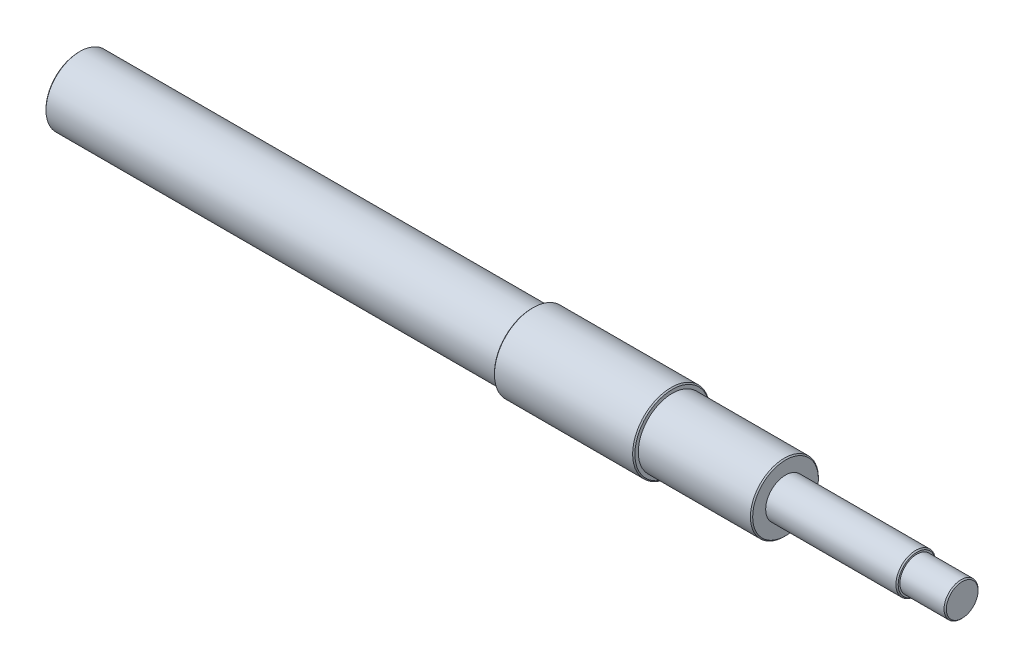
ISO-10303-21;
HEADER;
FILE_DESCRIPTION(('STEP AP214'),'2;1');
FILE_NAME('part.step','',(''),(''),'','','');
FILE_SCHEMA(('AUTOMOTIVE_DESIGN { 1 0 10303 214 1 1 1 1 }'));
ENDSEC;
DATA;
#1=APPLICATION_CONTEXT('core data for automotive mechanical design processes');
#2=APPLICATION_PROTOCOL_DEFINITION('international standard','automotive_design',2000,#1);
#3=PRODUCT_CONTEXT('',#1,'mechanical');
#4=PRODUCT('Part','Part','',(#3));
#5=PRODUCT_RELATED_PRODUCT_CATEGORY('part','',(#4));
#6=PRODUCT_DEFINITION_FORMATION('','',#4);
#7=PRODUCT_DEFINITION_CONTEXT('part definition',#1,'design');
#8=PRODUCT_DEFINITION('design','',#6,#7);
#9=PRODUCT_DEFINITION_SHAPE('','',#8);
#10=(LENGTH_UNIT() NAMED_UNIT(*) SI_UNIT(.MILLI.,.METRE.));
#11=(NAMED_UNIT(*) PLANE_ANGLE_UNIT() SI_UNIT($,.RADIAN.));
#12=(NAMED_UNIT(*) SI_UNIT($,.STERADIAN.) SOLID_ANGLE_UNIT());
#13=UNCERTAINTY_MEASURE_WITH_UNIT(LENGTH_MEASURE(1.E-05),#10,'distance_accuracy_value','');
#14=(GEOMETRIC_REPRESENTATION_CONTEXT(3) GLOBAL_UNCERTAINTY_ASSIGNED_CONTEXT((#13)) GLOBAL_UNIT_ASSIGNED_CONTEXT((#10,
#11,#12)) REPRESENTATION_CONTEXT('',''));
#15=CARTESIAN_POINT('',(0.,0.,0.));
#16=DIRECTION('',(0.,0.,1.));
#17=DIRECTION('',(1.,0.,0.));
#18=AXIS2_PLACEMENT_3D('',#15,#16,#17);
#19=CARTESIAN_POINT('',(-78.,0.,0.));
#20=DIRECTION('',(1.,0.,0.));
#21=DIRECTION('',(0.,0.,-1.));
#22=AXIS2_PLACEMENT_3D('',#19,#20,#21);
#23=PLANE('',#22);
#24=CARTESIAN_POINT('',(-78.,0.,0.));
#25=DIRECTION('',(1.,0.,0.));
#26=DIRECTION('',(0.,0.,-1.));
#27=AXIS2_PLACEMENT_3D('',#24,#25,#26);
#28=CIRCLE('',#27,2.89999999999999);
#29=CARTESIAN_POINT('',(-78.,0.,-2.89999999999999));
#30=VERTEX_POINT('',#29);
#31=EDGE_CURVE('E48',#30,#30,#28,.F.);
#32=ORIENTED_EDGE('',*,*,#31,.T.);
#33=EDGE_LOOP('',(#32));
#34=FACE_BOUND('',#33,.T.);
#35=ADVANCED_FACE('F39',(#34),#23,.F.);
#36=CARTESIAN_POINT('',(0.,0.,0.));
#37=DIRECTION('',(-1.,0.,0.));
#38=DIRECTION('',(0.,0.,1.));
#39=AXIS2_PLACEMENT_3D('',#36,#37,#38);
#40=CYLINDRICAL_SURFACE('',#39,2.99999999999999);
#41=CARTESIAN_POINT('',(-77.9,0.,0.));
#42=DIRECTION('',(1.,0.,0.));
#43=DIRECTION('',(0.,0.,-1.));
#44=AXIS2_PLACEMENT_3D('',#41,#42,#43);
#45=CIRCLE('',#44,2.99999999999999);
#46=CARTESIAN_POINT('',(-77.9,0.,-2.99999999999999));
#47=VERTEX_POINT('',#46);
#48=EDGE_CURVE('E10',#47,#47,#45,.T.);
#49=ORIENTED_EDGE('',*,*,#48,.T.);
#50=EDGE_LOOP('',(#49));
#51=FACE_BOUND('',#50,.T.);
#52=CARTESIAN_POINT('',(-38.,0.,0.));
#53=DIRECTION('',(-1.,0.,0.));
#54=DIRECTION('',(0.,0.,1.));
#55=AXIS2_PLACEMENT_3D('',#52,#53,#54);
#56=CIRCLE('',#55,2.99999999999999);
#57=CARTESIAN_POINT('',(-38.,0.,2.99999999999999));
#58=VERTEX_POINT('',#57);
#59=EDGE_CURVE('E96',#58,#58,#56,.T.);
#60=ORIENTED_EDGE('',*,*,#59,.T.);
#61=EDGE_LOOP('',(#60));
#62=FACE_BOUND('',#61,.T.);
#63=ADVANCED_FACE('F131',(#51,#62),#40,.T.);
#64=CARTESIAN_POINT('',(-38.,2.99999999999999,0.));
#65=DIRECTION('',(1.,0.,0.));
#66=DIRECTION('',(0.,0.,-1.));
#67=AXIS2_PLACEMENT_3D('',#64,#65,#66);
#68=PLANE('',#67);
#69=CARTESIAN_POINT('',(-38.,0.,0.));
#70=DIRECTION('',(1.,0.,0.));
#71=DIRECTION('',(0.,0.,-1.));
#72=AXIS2_PLACEMENT_3D('',#69,#70,#71);
#73=CIRCLE('',#72,3.29999999999998);
#74=CARTESIAN_POINT('',(-38.,0.,-3.29999999999998));
#75=VERTEX_POINT('',#74);
#76=EDGE_CURVE('E76',#75,#75,#73,.F.);
#77=ORIENTED_EDGE('',*,*,#76,.T.);
#78=EDGE_LOOP('',(#77));
#79=FACE_BOUND('',#78,.T.);
#80=ORIENTED_EDGE('',*,*,#59,.F.);
#81=EDGE_LOOP('',(#80));
#82=FACE_BOUND('',#81,.T.);
#83=ADVANCED_FACE('F136',(#79,#82),#68,.F.);
#84=CARTESIAN_POINT('',(0.,0.,0.));
#85=DIRECTION('',(-1.,0.,0.));
#86=DIRECTION('',(0.,0.,1.));
#87=AXIS2_PLACEMENT_3D('',#84,#85,#86);
#88=CYLINDRICAL_SURFACE('',#87,3.4);
#89=CARTESIAN_POINT('',(-37.9,0.,0.));
#90=DIRECTION('',(1.,0.,0.));
#91=DIRECTION('',(0.,0.,-1.));
#92=AXIS2_PLACEMENT_3D('',#89,#90,#91);
#93=CIRCLE('',#92,3.4);
#94=CARTESIAN_POINT('',(-37.9,0.,-3.4));
#95=VERTEX_POINT('',#94);
#96=EDGE_CURVE('E68',#95,#95,#93,.T.);
#97=ORIENTED_EDGE('',*,*,#96,.T.);
#98=EDGE_LOOP('',(#97));
#99=FACE_BOUND('',#98,.T.);
#100=CARTESIAN_POINT('',(-25.7,0.,0.));
#101=DIRECTION('',(-1.,0.,0.));
#102=DIRECTION('',(0.,0.,1.));
#103=AXIS2_PLACEMENT_3D('',#100,#101,#102);
#104=CIRCLE('',#103,3.4);
#105=CARTESIAN_POINT('',(-25.7,0.,3.4));
#106=VERTEX_POINT('',#105);
#107=EDGE_CURVE('E72',#106,#106,#104,.T.);
#108=ORIENTED_EDGE('',*,*,#107,.T.);
#109=EDGE_LOOP('',(#108));
#110=FACE_BOUND('',#109,.T.);
#111=ADVANCED_FACE('F189',(#99,#110),#88,.T.);
#112=CARTESIAN_POINT('',(-25.6,3.4,0.));
#113=DIRECTION('',(-1.,0.,0.));
#114=DIRECTION('',(0.,0.,1.));
#115=AXIS2_PLACEMENT_3D('',#112,#113,#114);
#116=PLANE('',#115);
#117=CARTESIAN_POINT('',(-25.6,0.,0.));
#118=DIRECTION('',(-1.,0.,0.));
#119=DIRECTION('',(0.,0.,1.));
#120=AXIS2_PLACEMENT_3D('',#117,#118,#119);
#121=CIRCLE('',#120,3.3);
#122=CARTESIAN_POINT('',(-25.6,0.,3.3));
#123=VERTEX_POINT('',#122);
#124=EDGE_CURVE('E64',#123,#123,#121,.F.);
#125=ORIENTED_EDGE('',*,*,#124,.T.);
#126=EDGE_LOOP('',(#125));
#127=FACE_BOUND('',#126,.T.);
#128=CARTESIAN_POINT('',(-25.6,0.,0.));
#129=DIRECTION('',(-1.,0.,0.));
#130=DIRECTION('',(0.,0.,1.));
#131=AXIS2_PLACEMENT_3D('',#128,#129,#130);
#132=CIRCLE('',#131,3.);
#133=CARTESIAN_POINT('',(-25.6,0.,3.));
#134=VERTEX_POINT('',#133);
#135=EDGE_CURVE('E100',#134,#134,#132,.T.);
#136=ORIENTED_EDGE('',*,*,#135,.T.);
#137=EDGE_LOOP('',(#136));
#138=FACE_BOUND('',#137,.T.);
#139=ADVANCED_FACE('F184',(#127,#138),#116,.F.);
#140=CARTESIAN_POINT('',(0.,0.,0.));
#141=DIRECTION('',(-1.,0.,0.));
#142=DIRECTION('',(0.,0.,1.));
#143=AXIS2_PLACEMENT_3D('',#140,#141,#142);
#144=CYLINDRICAL_SURFACE('',#143,3.);
#145=CARTESIAN_POINT('',(-15.7,0.,0.));
#146=DIRECTION('',(-1.,0.,0.));
#147=DIRECTION('',(0.,0.,1.));
#148=AXIS2_PLACEMENT_3D('',#145,#146,#147);
#149=CIRCLE('',#148,3.);
#150=CARTESIAN_POINT('',(-15.7,0.,3.));
#151=VERTEX_POINT('',#150);
#152=EDGE_CURVE('E58',#151,#151,#149,.T.);
#153=ORIENTED_EDGE('',*,*,#152,.T.);
#154=EDGE_LOOP('',(#153));
#155=FACE_BOUND('',#154,.T.);
#156=ORIENTED_EDGE('',*,*,#135,.F.);
#157=EDGE_LOOP('',(#156));
#158=FACE_BOUND('',#157,.T.);
#159=ADVANCED_FACE('F180',(#155,#158),#144,.T.);
#160=CARTESIAN_POINT('',(-15.6,3.,0.));
#161=DIRECTION('',(-1.,0.,0.));
#162=DIRECTION('',(0.,0.,1.));
#163=AXIS2_PLACEMENT_3D('',#160,#161,#162);
#164=PLANE('',#163);
#165=CARTESIAN_POINT('',(-15.6,0.,0.));
#166=DIRECTION('',(-1.,0.,0.));
#167=DIRECTION('',(0.,0.,1.));
#168=AXIS2_PLACEMENT_3D('',#165,#166,#167);
#169=CIRCLE('',#168,2.9);
#170=CARTESIAN_POINT('',(-15.6,0.,2.9));
#171=VERTEX_POINT('',#170);
#172=EDGE_CURVE('E53',#171,#171,#169,.F.);
#173=ORIENTED_EDGE('',*,*,#172,.T.);
#174=EDGE_LOOP('',(#173));
#175=FACE_BOUND('',#174,.T.);
#176=CARTESIAN_POINT('',(-15.6,0.,0.));
#177=DIRECTION('',(-1.,0.,0.));
#178=DIRECTION('',(0.,0.,1.));
#179=AXIS2_PLACEMENT_3D('',#176,#177,#178);
#180=CIRCLE('',#179,1.75);
#181=CARTESIAN_POINT('',(-15.6,0.,1.75));
#182=VERTEX_POINT('',#181);
#183=EDGE_CURVE('E104',#182,#182,#180,.T.);
#184=ORIENTED_EDGE('',*,*,#183,.T.);
#185=EDGE_LOOP('',(#184));
#186=FACE_BOUND('',#185,.T.);
#187=ADVANCED_FACE('F183',(#175,#186),#164,.F.);
#188=CARTESIAN_POINT('',(0.,0.,0.));
#189=DIRECTION('',(-1.,0.,0.));
#190=DIRECTION('',(0.,0.,1.));
#191=AXIS2_PLACEMENT_3D('',#188,#189,#190);
#192=CYLINDRICAL_SURFACE('',#191,1.75);
#193=CARTESIAN_POINT('',(-4.09999999999998,0.,0.));
#194=DIRECTION('',(-1.,0.,0.));
#195=DIRECTION('',(0.,0.,1.));
#196=AXIS2_PLACEMENT_3D('',#193,#194,#195);
#197=CIRCLE('',#196,1.75);
#198=CARTESIAN_POINT('',(-4.09999999999998,0.,1.75));
#199=VERTEX_POINT('',#198);
#200=EDGE_CURVE('E84',#199,#199,#197,.T.);
#201=ORIENTED_EDGE('',*,*,#200,.T.);
#202=EDGE_LOOP('',(#201));
#203=FACE_BOUND('',#202,.T.);
#204=ORIENTED_EDGE('',*,*,#183,.F.);
#205=EDGE_LOOP('',(#204));
#206=FACE_BOUND('',#205,.T.);
#207=ADVANCED_FACE('F127',(#203,#206),#192,.T.);
#208=CARTESIAN_POINT('',(-4.,1.75,0.));
#209=DIRECTION('',(-1.,0.,0.));
#210=DIRECTION('',(0.,0.,1.));
#211=AXIS2_PLACEMENT_3D('',#208,#209,#210);
#212=PLANE('',#211);
#213=CARTESIAN_POINT('',(-4.,0.,0.));
#214=DIRECTION('',(-1.,0.,0.));
#215=DIRECTION('',(0.,0.,1.));
#216=AXIS2_PLACEMENT_3D('',#213,#214,#215);
#217=CIRCLE('',#216,1.65000000000001);
#218=CARTESIAN_POINT('',(-4.,0.,1.65000000000001));
#219=VERTEX_POINT('',#218);
#220=EDGE_CURVE('E80',#219,#219,#217,.F.);
#221=ORIENTED_EDGE('',*,*,#220,.T.);
#222=EDGE_LOOP('',(#221));
#223=FACE_BOUND('',#222,.T.);
#224=CARTESIAN_POINT('',(-4.,0.,0.));
#225=DIRECTION('',(-1.,0.,0.));
#226=DIRECTION('',(0.,0.,1.));
#227=AXIS2_PLACEMENT_3D('',#224,#225,#226);
#228=CIRCLE('',#227,1.5);
#229=CARTESIAN_POINT('',(-4.,0.,1.5));
#230=VERTEX_POINT('',#229);
#231=EDGE_CURVE('E108',#230,#230,#228,.T.);
#232=ORIENTED_EDGE('',*,*,#231,.T.);
#233=EDGE_LOOP('',(#232));
#234=FACE_BOUND('',#233,.T.);
#235=ADVANCED_FACE('F113',(#223,#234),#212,.F.);
#236=CARTESIAN_POINT('',(0.,0.,0.));
#237=DIRECTION('',(-1.,0.,0.));
#238=DIRECTION('',(0.,0.,1.));
#239=AXIS2_PLACEMENT_3D('',#236,#237,#238);
#240=CYLINDRICAL_SURFACE('',#239,1.5);
#241=CARTESIAN_POINT('',(-0.0999999999999966,0.,0.));
#242=DIRECTION('',(-1.,0.,0.));
#243=DIRECTION('',(0.,0.,1.));
#244=AXIS2_PLACEMENT_3D('',#241,#242,#243);
#245=CIRCLE('',#244,1.5);
#246=CARTESIAN_POINT('',(-0.0999999999999966,0.,1.5));
#247=VERTEX_POINT('',#246);
#248=EDGE_CURVE('E92',#247,#247,#245,.T.);
#249=ORIENTED_EDGE('',*,*,#248,.T.);
#250=EDGE_LOOP('',(#249));
#251=FACE_BOUND('',#250,.T.);
#252=ORIENTED_EDGE('',*,*,#231,.F.);
#253=EDGE_LOOP('',(#252));
#254=FACE_BOUND('',#253,.T.);
#255=ADVANCED_FACE('F115',(#251,#254),#240,.T.);
#256=CARTESIAN_POINT('',(0.,1.5,0.));
#257=DIRECTION('',(-1.,0.,0.));
#258=DIRECTION('',(0.,0.,1.));
#259=AXIS2_PLACEMENT_3D('',#256,#257,#258);
#260=PLANE('',#259);
#261=CARTESIAN_POINT('',(0.,0.,0.));
#262=DIRECTION('',(-1.,0.,0.));
#263=DIRECTION('',(0.,0.,1.));
#264=AXIS2_PLACEMENT_3D('',#261,#262,#263);
#265=CIRCLE('',#264,1.4);
#266=CARTESIAN_POINT('',(0.,0.,1.4));
#267=VERTEX_POINT('',#266);
#268=EDGE_CURVE('E88',#267,#267,#265,.F.);
#269=ORIENTED_EDGE('',*,*,#268,.T.);
#270=EDGE_LOOP('',(#269));
#271=FACE_BOUND('',#270,.T.);
#272=ADVANCED_FACE('F117',(#271),#260,.F.);
#273=CARTESIAN_POINT('',(-0.0999999999999966,0.,0.));
#274=DIRECTION('',(-1.,0.,0.));
#275=DIRECTION('',(0.,0.,1.));
#276=AXIS2_PLACEMENT_3D('',#273,#274,#275);
#277=CONICAL_SURFACE('',#276,1.5,0.785398163397473);
#278=ORIENTED_EDGE('',*,*,#268,.F.);
#279=EDGE_LOOP('',(#278));
#280=FACE_BOUND('',#279,.T.);
#281=ORIENTED_EDGE('',*,*,#248,.F.);
#282=EDGE_LOOP('',(#281));
#283=FACE_BOUND('',#282,.T.);
#284=ADVANCED_FACE('F124',(#280,#283),#277,.T.);
#285=CARTESIAN_POINT('',(-4.09999999999998,0.,0.));
#286=DIRECTION('',(-1.,0.,0.));
#287=DIRECTION('',(0.,0.,1.));
#288=AXIS2_PLACEMENT_3D('',#285,#286,#287);
#289=CONICAL_SURFACE('',#288,1.75,0.785398163397451);
#290=ORIENTED_EDGE('',*,*,#220,.F.);
#291=EDGE_LOOP('',(#290));
#292=FACE_BOUND('',#291,.T.);
#293=ORIENTED_EDGE('',*,*,#200,.F.);
#294=EDGE_LOOP('',(#293));
#295=FACE_BOUND('',#294,.T.);
#296=ADVANCED_FACE('F146',(#292,#295),#289,.T.);
#297=CARTESIAN_POINT('',(-38.,0.,0.));
#298=DIRECTION('',(1.,0.,0.));
#299=DIRECTION('',(0.,0.,-1.));
#300=AXIS2_PLACEMENT_3D('',#297,#298,#299);
#301=CONICAL_SURFACE('',#300,3.29999999999998,0.785398163397422);
#302=ORIENTED_EDGE('',*,*,#96,.F.);
#303=EDGE_LOOP('',(#302));
#304=FACE_BOUND('',#303,.T.);
#305=ORIENTED_EDGE('',*,*,#76,.F.);
#306=EDGE_LOOP('',(#305));
#307=FACE_BOUND('',#306,.T.);
#308=ADVANCED_FACE('F153',(#304,#307),#301,.T.);
#309=CARTESIAN_POINT('',(-25.7,0.,0.));
#310=DIRECTION('',(-1.,0.,0.));
#311=DIRECTION('',(0.,0.,1.));
#312=AXIS2_PLACEMENT_3D('',#309,#310,#311);
#313=CONICAL_SURFACE('',#312,3.4,0.785398163397425);
#314=ORIENTED_EDGE('',*,*,#124,.F.);
#315=EDGE_LOOP('',(#314));
#316=FACE_BOUND('',#315,.T.);
#317=ORIENTED_EDGE('',*,*,#107,.F.);
#318=EDGE_LOOP('',(#317));
#319=FACE_BOUND('',#318,.T.);
#320=ADVANCED_FACE('F160',(#316,#319),#313,.T.);
#321=CARTESIAN_POINT('',(-15.7,0.,0.));
#322=DIRECTION('',(-1.,0.,0.));
#323=DIRECTION('',(0.,0.,1.));
#324=AXIS2_PLACEMENT_3D('',#321,#322,#323);
#325=CONICAL_SURFACE('',#324,3.,0.78539816339744);
#326=ORIENTED_EDGE('',*,*,#172,.F.);
#327=EDGE_LOOP('',(#326));
#328=FACE_BOUND('',#327,.T.);
#329=ORIENTED_EDGE('',*,*,#152,.F.);
#330=EDGE_LOOP('',(#329));
#331=FACE_BOUND('',#330,.T.);
#332=ADVANCED_FACE('F166',(#328,#331),#325,.T.);
#333=CARTESIAN_POINT('',(-78.,0.,0.));
#334=DIRECTION('',(1.,0.,0.));
#335=DIRECTION('',(0.,0.,-1.));
#336=AXIS2_PLACEMENT_3D('',#333,#334,#335);
#337=CONICAL_SURFACE('',#336,2.89999999999999,0.78539816339739);
#338=ORIENTED_EDGE('',*,*,#48,.F.);
#339=EDGE_LOOP('',(#338));
#340=FACE_BOUND('',#339,.T.);
#341=ORIENTED_EDGE('',*,*,#31,.F.);
#342=EDGE_LOOP('',(#341));
#343=FACE_BOUND('',#342,.T.);
#344=ADVANCED_FACE('F42',(#340,#343),#337,.T.);
#345=CLOSED_SHELL('',(#35,#63,#83,#111,#139,#159,#187,#207,#235,#255,#272,#284,#296,#308,#320,
#332,#344));
#346=MANIFOLD_SOLID_BREP('B2',#345);
#347=ADVANCED_BREP_SHAPE_REPRESENTATION('',(#18,#346),#14);
#348=SHAPE_DEFINITION_REPRESENTATION(#9,#347);
ENDSEC;
END-ISO-10303-21;
